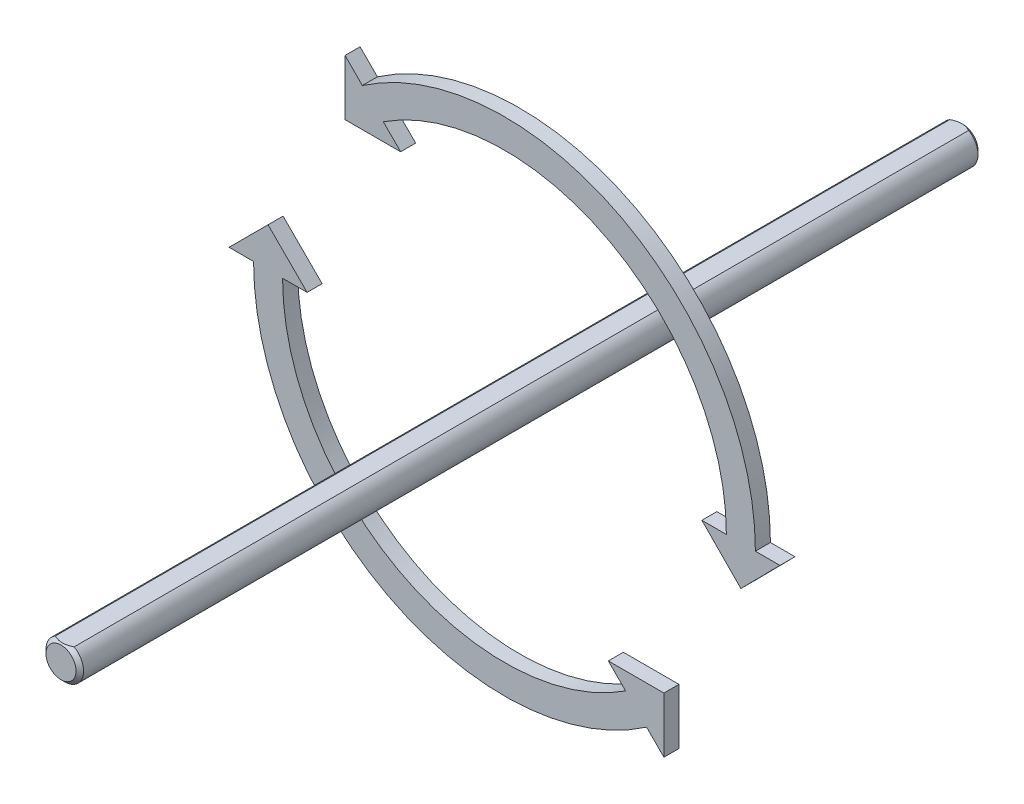
ISO-10303-21;
HEADER;
FILE_DESCRIPTION(('STEP AP214'),'2;1');
FILE_NAME('part.step','',(''),(''),'','','');
FILE_SCHEMA(('AUTOMOTIVE_DESIGN { 1 0 10303 214 1 1 1 1 }'));
ENDSEC;
DATA;
#1=APPLICATION_CONTEXT('core data for automotive mechanical design processes');
#2=APPLICATION_PROTOCOL_DEFINITION('international standard','automotive_design',2000,#1);
#3=PRODUCT_CONTEXT('',#1,'mechanical');
#4=PRODUCT('Part','Part','',(#3));
#5=PRODUCT_RELATED_PRODUCT_CATEGORY('part','',(#4));
#6=PRODUCT_DEFINITION_FORMATION('','',#4);
#7=PRODUCT_DEFINITION_CONTEXT('part definition',#1,'design');
#8=PRODUCT_DEFINITION('design','',#6,#7);
#9=PRODUCT_DEFINITION_SHAPE('','',#8);
#10=(LENGTH_UNIT() NAMED_UNIT(*) SI_UNIT(.MILLI.,.METRE.));
#11=(NAMED_UNIT(*) PLANE_ANGLE_UNIT() SI_UNIT($,.RADIAN.));
#12=(NAMED_UNIT(*) SI_UNIT($,.STERADIAN.) SOLID_ANGLE_UNIT());
#13=UNCERTAINTY_MEASURE_WITH_UNIT(LENGTH_MEASURE(1.E-05),#10,'distance_accuracy_value','');
#14=(GEOMETRIC_REPRESENTATION_CONTEXT(3) GLOBAL_UNCERTAINTY_ASSIGNED_CONTEXT((#13)) GLOBAL_UNIT_ASSIGNED_CONTEXT((#10,
#11,#12)) REPRESENTATION_CONTEXT('',''));
#15=CARTESIAN_POINT('',(0.,0.,0.));
#16=DIRECTION('',(0.,0.,1.));
#17=DIRECTION('',(1.,0.,0.));
#18=AXIS2_PLACEMENT_3D('',#15,#16,#17);
#19=CARTESIAN_POINT('',(-24.0076708422705,34.9446002853386,-1.27));
#20=DIRECTION('',(0.707106781186548,0.707106781186547,0.));
#21=DIRECTION('',(-0.707106781186547,0.707106781186548,0.));
#22=AXIS2_PLACEMENT_3D('',#19,#20,#21);
#23=PLANE('',#22);
#24=DIRECTION('',(0.,0.,1.));
#25=VECTOR('',#24,1.);
#26=CARTESIAN_POINT('',(-26.9402491764315,37.8771786194997,-1.27));
#27=LINE('',#26,#25);
#28=CARTESIAN_POINT('',(-26.9402491764315,37.8771786194997,-1.27));
#29=VERTEX_POINT('',#28);
#30=CARTESIAN_POINT('',(-26.9402491764315,37.8771786194997,1.27));
#31=VERTEX_POINT('',#30);
#32=EDGE_CURVE('E51',#29,#31,#27,.T.);
#33=ORIENTED_EDGE('',*,*,#32,.T.);
#34=DIRECTION('',(-0.707106781186547,0.707106781186548,0.));
#35=VECTOR('',#34,1.);
#36=CARTESIAN_POINT('',(-24.0076708422705,34.9446002853386,1.27));
#37=LINE('',#36,#35);
#38=CARTESIAN_POINT('',(-24.0076708422705,34.9446002853386,1.27));
#39=VERTEX_POINT('',#38);
#40=EDGE_CURVE('E124',#39,#31,#37,.T.);
#41=ORIENTED_EDGE('',*,*,#40,.F.);
#42=DIRECTION('',(0.,0.,1.));
#43=VECTOR('',#42,1.);
#44=CARTESIAN_POINT('',(-24.0076708422705,34.9446002853386,-1.27));
#45=LINE('',#44,#43);
#46=CARTESIAN_POINT('',(-24.0076708422705,34.9446002853386,-1.27));
#47=VERTEX_POINT('',#46);
#48=EDGE_CURVE('E12',#47,#39,#45,.T.);
#49=ORIENTED_EDGE('',*,*,#48,.F.);
#50=DIRECTION('',(-0.707106781186547,0.707106781186548,0.));
#51=VECTOR('',#50,1.);
#52=CARTESIAN_POINT('',(-24.0076708422705,34.9446002853386,-1.27));
#53=LINE('',#52,#51);
#54=EDGE_CURVE('E125',#47,#29,#53,.T.);
#55=ORIENTED_EDGE('',*,*,#54,.T.);
#56=EDGE_LOOP('',(#33,#41,#49,#55));
#57=FACE_BOUND('',#56,.T.);
#58=ADVANCED_FACE('F48',(#57),#23,.T.);
#59=CARTESIAN_POINT('',(0.,0.,-1.27));
#60=DIRECTION('',(0.,0.,1.));
#61=DIRECTION('',(1.,0.,0.));
#62=AXIS2_PLACEMENT_3D('',#59,#60,#61);
#63=CYLINDRICAL_SURFACE('',#62,42.3968554066559);
#64=ORIENTED_EDGE('',*,*,#48,.T.);
#65=CARTESIAN_POINT('',(0.,0.,1.27));
#66=DIRECTION('',(0.,0.,1.));
#67=DIRECTION('',(1.,0.,0.));
#68=AXIS2_PLACEMENT_3D('',#65,#66,#67);
#69=CIRCLE('',#68,42.3968554066559);
#70=CARTESIAN_POINT('',(42.3968554066559,0.,1.27));
#71=VERTEX_POINT('',#70);
#72=EDGE_CURVE('E142',#71,#39,#69,.T.);
#73=ORIENTED_EDGE('',*,*,#72,.F.);
#74=DIRECTION('',(0.,0.,1.));
#75=VECTOR('',#74,1.);
#76=CARTESIAN_POINT('',(42.3968554066559,0.,-1.27));
#77=LINE('',#76,#75);
#78=CARTESIAN_POINT('',(42.3968554066559,0.,-1.27));
#79=VERTEX_POINT('',#78);
#80=EDGE_CURVE('E56',#79,#71,#77,.T.);
#81=ORIENTED_EDGE('',*,*,#80,.F.);
#82=CARTESIAN_POINT('',(0.,0.,-1.27));
#83=DIRECTION('',(0.,0.,1.));
#84=DIRECTION('',(1.,0.,0.));
#85=AXIS2_PLACEMENT_3D('',#82,#83,#84);
#86=CIRCLE('',#85,42.3968554066559);
#87=EDGE_CURVE('E130',#79,#47,#86,.T.);
#88=ORIENTED_EDGE('',*,*,#87,.T.);
#89=EDGE_LOOP('',(#64,#73,#81,#88));
#90=FACE_BOUND('',#89,.T.);
#91=ADVANCED_FACE('F230',(#90),#63,.T.);
#92=CARTESIAN_POINT('',(46.544147459548,0.,-1.27));
#93=DIRECTION('',(0.,1.,0.));
#94=DIRECTION('',(-1.,0.,0.));
#95=AXIS2_PLACEMENT_3D('',#92,#93,#94);
#96=PLANE('',#95);
#97=ORIENTED_EDGE('',*,*,#80,.T.);
#98=DIRECTION('',(-1.,0.,0.));
#99=VECTOR('',#98,1.);
#100=CARTESIAN_POINT('',(46.544147459548,0.,1.27));
#101=LINE('',#100,#99);
#102=CARTESIAN_POINT('',(46.544147459548,0.,1.27));
#103=VERTEX_POINT('',#102);
#104=EDGE_CURVE('E161',#103,#71,#101,.T.);
#105=ORIENTED_EDGE('',*,*,#104,.F.);
#106=DIRECTION('',(0.,0.,1.));
#107=VECTOR('',#106,1.);
#108=CARTESIAN_POINT('',(46.544147459548,0.,-1.27));
#109=LINE('',#108,#107);
#110=CARTESIAN_POINT('',(46.544147459548,0.,-1.27));
#111=VERTEX_POINT('',#110);
#112=EDGE_CURVE('E189',#111,#103,#109,.T.);
#113=ORIENTED_EDGE('',*,*,#112,.F.);
#114=DIRECTION('',(-1.,0.,0.));
#115=VECTOR('',#114,1.);
#116=CARTESIAN_POINT('',(46.544147459548,0.,-1.27));
#117=LINE('',#116,#115);
#118=EDGE_CURVE('E185',#111,#79,#117,.T.);
#119=ORIENTED_EDGE('',*,*,#118,.T.);
#120=EDGE_LOOP('',(#97,#105,#113,#119));
#121=FACE_BOUND('',#120,.T.);
#122=ADVANCED_FACE('F228',(#121),#96,.T.);
#123=CARTESIAN_POINT('',(39.9465328725795,-6.69216374509598,-1.27));
#124=DIRECTION('',(0.712119419020724,-0.702058354450388,0.));
#125=DIRECTION('',(0.702058354450388,0.712119419020724,0.));
#126=AXIS2_PLACEMENT_3D('',#123,#124,#125);
#127=PLANE('',#126);
#128=ORIENTED_EDGE('',*,*,#112,.T.);
#129=DIRECTION('',(0.702058354450388,0.712119419020724,0.));
#130=VECTOR('',#129,1.);
#131=CARTESIAN_POINT('',(39.9465328725795,-6.69216374509598,1.27));
#132=LINE('',#131,#130);
#133=CARTESIAN_POINT('',(39.9465328725795,-6.69216374509598,1.27));
#134=VERTEX_POINT('',#133);
#135=EDGE_CURVE('E158',#134,#103,#132,.T.);
#136=ORIENTED_EDGE('',*,*,#135,.F.);
#137=DIRECTION('',(0.,0.,1.));
#138=VECTOR('',#137,1.);
#139=CARTESIAN_POINT('',(39.9465328725795,-6.69216374509598,-1.27));
#140=LINE('',#139,#138);
#141=CARTESIAN_POINT('',(39.9465328725795,-6.69216374509598,-1.27));
#142=VERTEX_POINT('',#141);
#143=EDGE_CURVE('E191',#142,#134,#140,.T.);
#144=ORIENTED_EDGE('',*,*,#143,.F.);
#145=DIRECTION('',(0.702058354450388,0.712119419020724,0.));
#146=VECTOR('',#145,1.);
#147=CARTESIAN_POINT('',(39.9465328725795,-6.69216374509598,-1.27));
#148=LINE('',#147,#146);
#149=EDGE_CURVE('E182',#142,#111,#148,.T.);
#150=ORIENTED_EDGE('',*,*,#149,.T.);
#151=EDGE_LOOP('',(#128,#136,#144,#150));
#152=FACE_BOUND('',#151,.T.);
#153=ADVANCED_FACE('F224',(#152),#127,.T.);
#154=CARTESIAN_POINT('',(33.3489182856111,0.,-1.27));
#155=DIRECTION('',(-0.712119419020723,-0.702058354450389,0.));
#156=DIRECTION('',(0.702058354450389,-0.712119419020723,0.));
#157=AXIS2_PLACEMENT_3D('',#154,#155,#156);
#158=PLANE('',#157);
#159=ORIENTED_EDGE('',*,*,#143,.T.);
#160=DIRECTION('',(0.702058354450389,-0.712119419020723,0.));
#161=VECTOR('',#160,1.);
#162=CARTESIAN_POINT('',(33.3489182856111,0.,1.27));
#163=LINE('',#162,#161);
#164=CARTESIAN_POINT('',(33.3489182856111,0.,1.27));
#165=VERTEX_POINT('',#164);
#166=EDGE_CURVE('E155',#165,#134,#163,.T.);
#167=ORIENTED_EDGE('',*,*,#166,.F.);
#168=DIRECTION('',(0.,0.,1.));
#169=VECTOR('',#168,1.);
#170=CARTESIAN_POINT('',(33.3489182856111,0.,-1.27));
#171=LINE('',#170,#169);
#172=CARTESIAN_POINT('',(33.3489182856111,0.,-1.27));
#173=VERTEX_POINT('',#172);
#174=EDGE_CURVE('E193',#173,#165,#171,.T.);
#175=ORIENTED_EDGE('',*,*,#174,.F.);
#176=DIRECTION('',(0.702058354450389,-0.712119419020723,0.));
#177=VECTOR('',#176,1.);
#178=CARTESIAN_POINT('',(33.3489182856111,0.,-1.27));
#179=LINE('',#178,#177);
#180=EDGE_CURVE('E179',#173,#142,#179,.T.);
#181=ORIENTED_EDGE('',*,*,#180,.T.);
#182=EDGE_LOOP('',(#159,#167,#175,#181));
#183=FACE_BOUND('',#182,.T.);
#184=ADVANCED_FACE('F222',(#183),#158,.T.);
#185=CARTESIAN_POINT('',(37.4962103385031,0.,-1.27));
#186=DIRECTION('',(0.,1.,0.));
#187=DIRECTION('',(0.,0.,1.));
#188=AXIS2_PLACEMENT_3D('',#185,#186,#187);
#189=PLANE('',#188);
#190=ORIENTED_EDGE('',*,*,#174,.T.);
#191=DIRECTION('',(-1.,0.,0.));
#192=VECTOR('',#191,1.);
#193=CARTESIAN_POINT('',(37.4962103385031,0.,1.27));
#194=LINE('',#193,#192);
#195=CARTESIAN_POINT('',(37.4962103385031,0.,1.27));
#196=VERTEX_POINT('',#195);
#197=EDGE_CURVE('E152',#196,#165,#194,.T.);
#198=ORIENTED_EDGE('',*,*,#197,.F.);
#199=DIRECTION('',(0.,0.,1.));
#200=VECTOR('',#199,1.);
#201=CARTESIAN_POINT('',(37.4962103385031,0.,-1.27));
#202=LINE('',#201,#200);
#203=CARTESIAN_POINT('',(37.4962103385031,0.,-1.27));
#204=VERTEX_POINT('',#203);
#205=EDGE_CURVE('E195',#204,#196,#202,.T.);
#206=ORIENTED_EDGE('',*,*,#205,.F.);
#207=DIRECTION('',(-1.,0.,0.));
#208=VECTOR('',#207,1.);
#209=CARTESIAN_POINT('',(37.4962103385031,0.,-1.27));
#210=LINE('',#209,#208);
#211=EDGE_CURVE('E176',#204,#173,#210,.T.);
#212=ORIENTED_EDGE('',*,*,#211,.T.);
#213=EDGE_LOOP('',(#190,#198,#206,#212));
#214=FACE_BOUND('',#213,.T.);
#215=ADVANCED_FACE('F217',(#214),#189,.T.);
#216=CARTESIAN_POINT('',(0.,0.,-1.27));
#217=DIRECTION('',(0.,0.,1.));
#218=DIRECTION('',(1.,0.,0.));
#219=AXIS2_PLACEMENT_3D('',#216,#217,#218);
#220=CYLINDRICAL_SURFACE('',#219,37.4962103385031);
#221=ORIENTED_EDGE('',*,*,#205,.T.);
#222=CARTESIAN_POINT('',(0.,0.,1.27));
#223=DIRECTION('',(0.,0.,-1.));
#224=DIRECTION('',(1.,0.,0.));
#225=AXIS2_PLACEMENT_3D('',#222,#223,#224);
#226=CIRCLE('',#225,37.4962103385031);
#227=CARTESIAN_POINT('',(-20.4752973122183,31.4122267552864,1.27));
#228=VERTEX_POINT('',#227);
#229=EDGE_CURVE('E149',#228,#196,#226,.T.);
#230=ORIENTED_EDGE('',*,*,#229,.F.);
#231=DIRECTION('',(0.,0.,1.));
#232=VECTOR('',#231,1.);
#233=CARTESIAN_POINT('',(-20.4752973122183,31.4122267552864,-1.27));
#234=LINE('',#233,#232);
#235=CARTESIAN_POINT('',(-20.4752973122183,31.4122267552864,-1.27));
#236=VERTEX_POINT('',#235);
#237=EDGE_CURVE('E197',#236,#228,#234,.T.);
#238=ORIENTED_EDGE('',*,*,#237,.F.);
#239=CARTESIAN_POINT('',(0.,0.,-1.27));
#240=DIRECTION('',(0.,0.,-1.));
#241=DIRECTION('',(1.,0.,0.));
#242=AXIS2_PLACEMENT_3D('',#239,#240,#241);
#243=CIRCLE('',#242,37.4962103385031);
#244=EDGE_CURVE('E173',#236,#204,#243,.T.);
#245=ORIENTED_EDGE('',*,*,#244,.T.);
#246=EDGE_LOOP('',(#221,#230,#238,#245));
#247=FACE_BOUND('',#246,.T.);
#248=ADVANCED_FACE('F210',(#247),#220,.F.);
#249=CARTESIAN_POINT('',(-17.5427189780573,28.4796484211254,-1.27));
#250=DIRECTION('',(0.707106781186547,0.707106781186548,0.));
#251=DIRECTION('',(-0.707106781186548,0.707106781186547,0.));
#252=AXIS2_PLACEMENT_3D('',#249,#250,#251);
#253=PLANE('',#252);
#254=ORIENTED_EDGE('',*,*,#237,.T.);
#255=DIRECTION('',(-0.707106781186548,0.707106781186547,0.));
#256=VECTOR('',#255,1.);
#257=CARTESIAN_POINT('',(-17.5427189780573,28.4796484211254,1.27));
#258=LINE('',#257,#256);
#259=CARTESIAN_POINT('',(-17.5427189780573,28.4796484211254,1.27));
#260=VERTEX_POINT('',#259);
#261=EDGE_CURVE('E146',#260,#228,#258,.T.);
#262=ORIENTED_EDGE('',*,*,#261,.F.);
#263=DIRECTION('',(0.,0.,1.));
#264=VECTOR('',#263,1.);
#265=CARTESIAN_POINT('',(-17.5427189780573,28.4796484211254,-1.27));
#266=LINE('',#265,#264);
#267=CARTESIAN_POINT('',(-17.5427189780573,28.4796484211254,-1.27));
#268=VERTEX_POINT('',#267);
#269=EDGE_CURVE('E199',#268,#260,#266,.T.);
#270=ORIENTED_EDGE('',*,*,#269,.F.);
#271=DIRECTION('',(-0.707106781186548,0.707106781186547,0.));
#272=VECTOR('',#271,1.);
#273=CARTESIAN_POINT('',(-17.5427189780573,28.4796484211254,-1.27));
#274=LINE('',#273,#272);
#275=EDGE_CURVE('E170',#268,#236,#274,.T.);
#276=ORIENTED_EDGE('',*,*,#275,.T.);
#277=EDGE_LOOP('',(#254,#262,#270,#276));
#278=FACE_BOUND('',#277,.T.);
#279=ADVANCED_FACE('F207',(#278),#253,.T.);
#280=CARTESIAN_POINT('',(-26.9402491764315,28.4796484211254,-1.27));
#281=DIRECTION('',(0.,-1.,0.));
#282=DIRECTION('',(1.,0.,0.));
#283=AXIS2_PLACEMENT_3D('',#280,#281,#282);
#284=PLANE('',#283);
#285=ORIENTED_EDGE('',*,*,#269,.T.);
#286=DIRECTION('',(1.,0.,0.));
#287=VECTOR('',#286,1.);
#288=CARTESIAN_POINT('',(-26.9402491764315,28.4796484211254,1.27));
#289=LINE('',#288,#287);
#290=CARTESIAN_POINT('',(-26.9402491764315,28.4796484211254,1.27));
#291=VERTEX_POINT('',#290);
#292=EDGE_CURVE('E137',#291,#260,#289,.T.);
#293=ORIENTED_EDGE('',*,*,#292,.F.);
#294=DIRECTION('',(0.,0.,1.));
#295=VECTOR('',#294,1.);
#296=CARTESIAN_POINT('',(-26.9402491764315,28.4796484211254,-1.27));
#297=LINE('',#296,#295);
#298=CARTESIAN_POINT('',(-26.9402491764315,28.4796484211254,-1.27));
#299=VERTEX_POINT('',#298);
#300=EDGE_CURVE('E129',#299,#291,#297,.T.);
#301=ORIENTED_EDGE('',*,*,#300,.F.);
#302=DIRECTION('',(1.,0.,0.));
#303=VECTOR('',#302,1.);
#304=CARTESIAN_POINT('',(-26.9402491764315,28.4796484211254,-1.27));
#305=LINE('',#304,#303);
#306=EDGE_CURVE('E167',#299,#268,#305,.T.);
#307=ORIENTED_EDGE('',*,*,#306,.T.);
#308=EDGE_LOOP('',(#285,#293,#301,#307));
#309=FACE_BOUND('',#308,.T.);
#310=ADVANCED_FACE('F201',(#309),#284,.T.);
#311=CARTESIAN_POINT('',(-26.9402491764315,37.8771786194997,-1.27));
#312=DIRECTION('',(-1.,0.,0.));
#313=DIRECTION('',(0.,0.,1.));
#314=AXIS2_PLACEMENT_3D('',#311,#312,#313);
#315=PLANE('',#314);
#316=ORIENTED_EDGE('',*,*,#300,.T.);
#317=DIRECTION('',(0.,-1.,0.));
#318=VECTOR('',#317,1.);
#319=CARTESIAN_POINT('',(-26.9402491764315,37.8771786194997,1.27));
#320=LINE('',#319,#318);
#321=EDGE_CURVE('E132',#31,#291,#320,.T.);
#322=ORIENTED_EDGE('',*,*,#321,.F.);
#323=ORIENTED_EDGE('',*,*,#32,.F.);
#324=DIRECTION('',(0.,-1.,0.));
#325=VECTOR('',#324,1.);
#326=CARTESIAN_POINT('',(-26.9402491764315,37.8771786194997,-1.27));
#327=LINE('',#326,#325);
#328=EDGE_CURVE('E165',#29,#299,#327,.T.);
#329=ORIENTED_EDGE('',*,*,#328,.T.);
#330=EDGE_LOOP('',(#316,#322,#323,#329));
#331=FACE_BOUND('',#330,.T.);
#332=ADVANCED_FACE('F133',(#331),#315,.T.);
#333=CARTESIAN_POINT('',(0.,0.,-1.27));
#334=DIRECTION('',(0.,0.,1.));
#335=DIRECTION('',(1.,0.,0.));
#336=AXIS2_PLACEMENT_3D('',#333,#334,#335);
#337=PLANE('',#336);
#338=ORIENTED_EDGE('',*,*,#54,.F.);
#339=ORIENTED_EDGE('',*,*,#87,.F.);
#340=ORIENTED_EDGE('',*,*,#118,.F.);
#341=ORIENTED_EDGE('',*,*,#149,.F.);
#342=ORIENTED_EDGE('',*,*,#180,.F.);
#343=ORIENTED_EDGE('',*,*,#211,.F.);
#344=ORIENTED_EDGE('',*,*,#244,.F.);
#345=ORIENTED_EDGE('',*,*,#275,.F.);
#346=ORIENTED_EDGE('',*,*,#306,.F.);
#347=ORIENTED_EDGE('',*,*,#328,.F.);
#348=EDGE_LOOP('',(#338,#339,#340,#341,#342,#343,#344,#345,#346,#347));
#349=FACE_BOUND('',#348,.T.);
#350=ADVANCED_FACE('F213',(#349),#337,.F.);
#351=CARTESIAN_POINT('',(0.,0.,1.27));
#352=DIRECTION('',(0.,0.,1.));
#353=DIRECTION('',(1.,0.,0.));
#354=AXIS2_PLACEMENT_3D('',#351,#352,#353);
#355=PLANE('',#354);
#356=ORIENTED_EDGE('',*,*,#40,.T.);
#357=ORIENTED_EDGE('',*,*,#321,.T.);
#358=ORIENTED_EDGE('',*,*,#292,.T.);
#359=ORIENTED_EDGE('',*,*,#261,.T.);
#360=ORIENTED_EDGE('',*,*,#229,.T.);
#361=ORIENTED_EDGE('',*,*,#197,.T.);
#362=ORIENTED_EDGE('',*,*,#166,.T.);
#363=ORIENTED_EDGE('',*,*,#135,.T.);
#364=ORIENTED_EDGE('',*,*,#104,.T.);
#365=ORIENTED_EDGE('',*,*,#72,.T.);
#366=EDGE_LOOP('',(#356,#357,#358,#359,#360,#361,#362,#363,#364,#365));
#367=FACE_BOUND('',#366,.T.);
#368=ADVANCED_FACE('F140',(#367),#355,.T.);
#369=CLOSED_SHELL('',(#58,#91,#122,#153,#184,#215,#248,#279,#310,#332,#350,#368));
#370=MANIFOLD_SOLID_BREP('B2',#369);
#371=CARTESIAN_POINT('',(-39.9465328725795,6.59761458696847,-1.27));
#372=DIRECTION('',(-0.707106781186548,0.707106781186548,0.));
#373=DIRECTION('',(-0.707106781186548,-0.707106781186548,0.));
#374=AXIS2_PLACEMENT_3D('',#371,#372,#373);
#375=PLANE('',#374);
#376=DIRECTION('',(0.,0.,1.));
#377=VECTOR('',#376,1.);
#378=CARTESIAN_POINT('',(-46.544147459548,0.,-1.27));
#379=LINE('',#378,#377);
#380=CARTESIAN_POINT('',(-46.544147459548,0.,-1.27));
#381=VERTEX_POINT('',#380);
#382=CARTESIAN_POINT('',(-46.544147459548,0.,1.27));
#383=VERTEX_POINT('',#382);
#384=EDGE_CURVE('E340',#381,#383,#379,.T.);
#385=ORIENTED_EDGE('',*,*,#384,.T.);
#386=DIRECTION('',(-0.707106781186547,-0.707106781186547,0.));
#387=VECTOR('',#386,1.);
#388=CARTESIAN_POINT('',(-39.9465328725795,6.59761458696847,1.27));
#389=LINE('',#388,#387);
#390=CARTESIAN_POINT('',(-39.9465328725795,6.59761458696847,1.27));
#391=VERTEX_POINT('',#390);
#392=EDGE_CURVE('E413',#391,#383,#389,.T.);
#393=ORIENTED_EDGE('',*,*,#392,.F.);
#394=DIRECTION('',(0.,0.,1.));
#395=VECTOR('',#394,1.);
#396=CARTESIAN_POINT('',(-39.9465328725795,6.59761458696847,-1.27));
#397=LINE('',#396,#395);
#398=CARTESIAN_POINT('',(-39.9465328725795,6.59761458696847,-1.27));
#399=VERTEX_POINT('',#398);
#400=EDGE_CURVE('E46',#399,#391,#397,.T.);
#401=ORIENTED_EDGE('',*,*,#400,.F.);
#402=DIRECTION('',(-0.707106781186547,-0.707106781186547,0.));
#403=VECTOR('',#402,1.);
#404=CARTESIAN_POINT('',(-39.9465328725795,6.59761458696847,-1.27));
#405=LINE('',#404,#403);
#406=EDGE_CURVE('E414',#399,#381,#405,.T.);
#407=ORIENTED_EDGE('',*,*,#406,.T.);
#408=EDGE_LOOP('',(#385,#393,#401,#407));
#409=FACE_BOUND('',#408,.T.);
#410=ADVANCED_FACE('F337',(#409),#375,.T.);
#411=CARTESIAN_POINT('',(-33.3489182856111,0.,-1.27));
#412=DIRECTION('',(0.707106781186548,0.707106781186548,0.));
#413=DIRECTION('',(-0.707106781186548,0.707106781186548,0.));
#414=AXIS2_PLACEMENT_3D('',#411,#412,#413);
#415=PLANE('',#414);
#416=ORIENTED_EDGE('',*,*,#400,.T.);
#417=DIRECTION('',(-0.707106781186547,0.707106781186547,0.));
#418=VECTOR('',#417,1.);
#419=CARTESIAN_POINT('',(-33.3489182856111,0.,1.27));
#420=LINE('',#419,#418);
#421=CARTESIAN_POINT('',(-33.3489182856111,0.,1.27));
#422=VERTEX_POINT('',#421);
#423=EDGE_CURVE('E431',#422,#391,#420,.T.);
#424=ORIENTED_EDGE('',*,*,#423,.F.);
#425=DIRECTION('',(0.,0.,1.));
#426=VECTOR('',#425,1.);
#427=CARTESIAN_POINT('',(-33.3489182856111,0.,-1.27));
#428=LINE('',#427,#426);
#429=CARTESIAN_POINT('',(-33.3489182856111,0.,-1.27));
#430=VERTEX_POINT('',#429);
#431=EDGE_CURVE('E345',#430,#422,#428,.T.);
#432=ORIENTED_EDGE('',*,*,#431,.F.);
#433=DIRECTION('',(-0.707106781186547,0.707106781186547,0.));
#434=VECTOR('',#433,1.);
#435=CARTESIAN_POINT('',(-33.3489182856111,0.,-1.27));
#436=LINE('',#435,#434);
#437=EDGE_CURVE('E419',#430,#399,#436,.T.);
#438=ORIENTED_EDGE('',*,*,#437,.T.);
#439=EDGE_LOOP('',(#416,#424,#432,#438));
#440=FACE_BOUND('',#439,.T.);
#441=ADVANCED_FACE('F519',(#440),#415,.T.);
#442=CARTESIAN_POINT('',(-37.4962103385031,0.,-1.27));
#443=DIRECTION('',(0.,-1.,0.));
#444=DIRECTION('',(0.,0.,-1.));
#445=AXIS2_PLACEMENT_3D('',#442,#443,#444);
#446=PLANE('',#445);
#447=ORIENTED_EDGE('',*,*,#431,.T.);
#448=DIRECTION('',(1.,0.,0.));
#449=VECTOR('',#448,1.);
#450=CARTESIAN_POINT('',(-37.4962103385031,0.,1.27));
#451=LINE('',#450,#449);
#452=CARTESIAN_POINT('',(-37.4962103385031,0.,1.27));
#453=VERTEX_POINT('',#452);
#454=EDGE_CURVE('E450',#453,#422,#451,.T.);
#455=ORIENTED_EDGE('',*,*,#454,.F.);
#456=DIRECTION('',(0.,0.,1.));
#457=VECTOR('',#456,1.);
#458=CARTESIAN_POINT('',(-37.4962103385031,0.,-1.27));
#459=LINE('',#458,#457);
#460=CARTESIAN_POINT('',(-37.4962103385031,0.,-1.27));
#461=VERTEX_POINT('',#460);
#462=EDGE_CURVE('E478',#461,#453,#459,.T.);
#463=ORIENTED_EDGE('',*,*,#462,.F.);
#464=DIRECTION('',(1.,0.,0.));
#465=VECTOR('',#464,1.);
#466=CARTESIAN_POINT('',(-37.4962103385031,0.,-1.27));
#467=LINE('',#466,#465);
#468=EDGE_CURVE('E474',#461,#430,#467,.T.);
#469=ORIENTED_EDGE('',*,*,#468,.T.);
#470=EDGE_LOOP('',(#447,#455,#463,#469));
#471=FACE_BOUND('',#470,.T.);
#472=ADVANCED_FACE('F517',(#471),#446,.T.);
#473=CARTESIAN_POINT('',(0.,0.,-1.27));
#474=DIRECTION('',(0.,0.,1.));
#475=DIRECTION('',(1.,0.,0.));
#476=AXIS2_PLACEMENT_3D('',#473,#474,#475);
#477=CYLINDRICAL_SURFACE('',#476,37.4962103385031);
#478=ORIENTED_EDGE('',*,*,#462,.T.);
#479=CARTESIAN_POINT('',(0.,0.,1.27));
#480=DIRECTION('',(0.,0.,-1.));
#481=DIRECTION('',(1.,0.,0.));
#482=AXIS2_PLACEMENT_3D('',#479,#480,#481);
#483=CIRCLE('',#482,37.4962103385031);
#484=CARTESIAN_POINT('',(20.4752973122183,-31.4122267552864,1.27));
#485=VERTEX_POINT('',#484);
#486=EDGE_CURVE('E447',#485,#453,#483,.T.);
#487=ORIENTED_EDGE('',*,*,#486,.F.);
#488=DIRECTION('',(0.,0.,1.));
#489=VECTOR('',#488,1.);
#490=CARTESIAN_POINT('',(20.4752973122183,-31.4122267552864,-1.27));
#491=LINE('',#490,#489);
#492=CARTESIAN_POINT('',(20.4752973122183,-31.4122267552864,-1.27));
#493=VERTEX_POINT('',#492);
#494=EDGE_CURVE('E480',#493,#485,#491,.T.);
#495=ORIENTED_EDGE('',*,*,#494,.F.);
#496=CARTESIAN_POINT('',(0.,0.,-1.27));
#497=DIRECTION('',(0.,0.,-1.));
#498=DIRECTION('',(1.,0.,0.));
#499=AXIS2_PLACEMENT_3D('',#496,#497,#498);
#500=CIRCLE('',#499,37.4962103385031);
#501=EDGE_CURVE('E471',#493,#461,#500,.T.);
#502=ORIENTED_EDGE('',*,*,#501,.T.);
#503=EDGE_LOOP('',(#478,#487,#495,#502));
#504=FACE_BOUND('',#503,.T.);
#505=ADVANCED_FACE('F513',(#504),#477,.F.);
#506=CARTESIAN_POINT('',(17.5427189780573,-28.4796484211254,-1.27));
#507=DIRECTION('',(-0.707106781186548,-0.707106781186548,0.));
#508=DIRECTION('',(0.707106781186548,-0.707106781186548,0.));
#509=AXIS2_PLACEMENT_3D('',#506,#507,#508);
#510=PLANE('',#509);
#511=ORIENTED_EDGE('',*,*,#494,.T.);
#512=DIRECTION('',(0.707106781186548,-0.707106781186548,0.));
#513=VECTOR('',#512,1.);
#514=CARTESIAN_POINT('',(17.5427189780573,-28.4796484211254,1.27));
#515=LINE('',#514,#513);
#516=CARTESIAN_POINT('',(17.5427189780573,-28.4796484211254,1.27));
#517=VERTEX_POINT('',#516);
#518=EDGE_CURVE('E444',#517,#485,#515,.T.);
#519=ORIENTED_EDGE('',*,*,#518,.F.);
#520=DIRECTION('',(0.,0.,1.));
#521=VECTOR('',#520,1.);
#522=CARTESIAN_POINT('',(17.5427189780573,-28.4796484211254,-1.27));
#523=LINE('',#522,#521);
#524=CARTESIAN_POINT('',(17.5427189780573,-28.4796484211254,-1.27));
#525=VERTEX_POINT('',#524);
#526=EDGE_CURVE('E482',#525,#517,#523,.T.);
#527=ORIENTED_EDGE('',*,*,#526,.F.);
#528=DIRECTION('',(0.707106781186548,-0.707106781186548,0.));
#529=VECTOR('',#528,1.);
#530=CARTESIAN_POINT('',(17.5427189780573,-28.4796484211254,-1.27));
#531=LINE('',#530,#529);
#532=EDGE_CURVE('E468',#525,#493,#531,.T.);
#533=ORIENTED_EDGE('',*,*,#532,.T.);
#534=EDGE_LOOP('',(#511,#519,#527,#533));
#535=FACE_BOUND('',#534,.T.);
#536=ADVANCED_FACE('F511',(#535),#510,.T.);
#537=CARTESIAN_POINT('',(26.9402491764315,-28.4796484211254,-1.27));
#538=DIRECTION('',(0.,1.,0.));
#539=DIRECTION('',(-1.,0.,0.));
#540=AXIS2_PLACEMENT_3D('',#537,#538,#539);
#541=PLANE('',#540);
#542=ORIENTED_EDGE('',*,*,#526,.T.);
#543=DIRECTION('',(-1.,0.,0.));
#544=VECTOR('',#543,1.);
#545=CARTESIAN_POINT('',(26.9402491764315,-28.4796484211254,1.27));
#546=LINE('',#545,#544);
#547=CARTESIAN_POINT('',(26.9402491764315,-28.4796484211254,1.27));
#548=VERTEX_POINT('',#547);
#549=EDGE_CURVE('E441',#548,#517,#546,.T.);
#550=ORIENTED_EDGE('',*,*,#549,.F.);
#551=DIRECTION('',(0.,0.,1.));
#552=VECTOR('',#551,1.);
#553=CARTESIAN_POINT('',(26.9402491764315,-28.4796484211254,-1.27));
#554=LINE('',#553,#552);
#555=CARTESIAN_POINT('',(26.9402491764315,-28.4796484211254,-1.27));
#556=VERTEX_POINT('',#555);
#557=EDGE_CURVE('E484',#556,#548,#554,.T.);
#558=ORIENTED_EDGE('',*,*,#557,.F.);
#559=DIRECTION('',(-1.,0.,0.));
#560=VECTOR('',#559,1.);
#561=CARTESIAN_POINT('',(26.9402491764315,-28.4796484211254,-1.27));
#562=LINE('',#561,#560);
#563=EDGE_CURVE('E465',#556,#525,#562,.T.);
#564=ORIENTED_EDGE('',*,*,#563,.T.);
#565=EDGE_LOOP('',(#542,#550,#558,#564));
#566=FACE_BOUND('',#565,.T.);
#567=ADVANCED_FACE('F506',(#566),#541,.T.);
#568=CARTESIAN_POINT('',(26.9402491764315,-37.8771786194996,-1.27));
#569=DIRECTION('',(1.,0.,0.));
#570=DIRECTION('',(0.,0.,-1.));
#571=AXIS2_PLACEMENT_3D('',#568,#569,#570);
#572=PLANE('',#571);
#573=ORIENTED_EDGE('',*,*,#557,.T.);
#574=DIRECTION('',(0.,1.,0.));
#575=VECTOR('',#574,1.);
#576=CARTESIAN_POINT('',(26.9402491764315,-37.8771786194996,1.27));
#577=LINE('',#576,#575);
#578=CARTESIAN_POINT('',(26.9402491764315,-37.8771786194996,1.27));
#579=VERTEX_POINT('',#578);
#580=EDGE_CURVE('E438',#579,#548,#577,.T.);
#581=ORIENTED_EDGE('',*,*,#580,.F.);
#582=DIRECTION('',(0.,0.,1.));
#583=VECTOR('',#582,1.);
#584=CARTESIAN_POINT('',(26.9402491764315,-37.8771786194996,-1.27));
#585=LINE('',#584,#583);
#586=CARTESIAN_POINT('',(26.9402491764315,-37.8771786194996,-1.27));
#587=VERTEX_POINT('',#586);
#588=EDGE_CURVE('E486',#587,#579,#585,.T.);
#589=ORIENTED_EDGE('',*,*,#588,.F.);
#590=DIRECTION('',(0.,1.,0.));
#591=VECTOR('',#590,1.);
#592=CARTESIAN_POINT('',(26.9402491764315,-37.8771786194996,-1.27));
#593=LINE('',#592,#591);
#594=EDGE_CURVE('E462',#587,#556,#593,.T.);
#595=ORIENTED_EDGE('',*,*,#594,.T.);
#596=EDGE_LOOP('',(#573,#581,#589,#595));
#597=FACE_BOUND('',#596,.T.);
#598=ADVANCED_FACE('F499',(#597),#572,.T.);
#599=CARTESIAN_POINT('',(24.0076708422705,-34.9446002853386,-1.27));
#600=DIRECTION('',(-0.707106781186548,-0.707106781186548,0.));
#601=DIRECTION('',(0.707106781186548,-0.707106781186548,0.));
#602=AXIS2_PLACEMENT_3D('',#599,#600,#601);
#603=PLANE('',#602);
#604=ORIENTED_EDGE('',*,*,#588,.T.);
#605=DIRECTION('',(0.707106781186547,-0.707106781186547,0.));
#606=VECTOR('',#605,1.);
#607=CARTESIAN_POINT('',(24.0076708422705,-34.9446002853386,1.27));
#608=LINE('',#607,#606);
#609=CARTESIAN_POINT('',(24.0076708422705,-34.9446002853386,1.27));
#610=VERTEX_POINT('',#609);
#611=EDGE_CURVE('E435',#610,#579,#608,.T.);
#612=ORIENTED_EDGE('',*,*,#611,.F.);
#613=DIRECTION('',(0.,0.,1.));
#614=VECTOR('',#613,1.);
#615=CARTESIAN_POINT('',(24.0076708422705,-34.9446002853386,-1.27));
#616=LINE('',#615,#614);
#617=CARTESIAN_POINT('',(24.0076708422705,-34.9446002853386,-1.27));
#618=VERTEX_POINT('',#617);
#619=EDGE_CURVE('E488',#618,#610,#616,.T.);
#620=ORIENTED_EDGE('',*,*,#619,.F.);
#621=DIRECTION('',(0.707106781186547,-0.707106781186547,0.));
#622=VECTOR('',#621,1.);
#623=CARTESIAN_POINT('',(24.0076708422705,-34.9446002853386,-1.27));
#624=LINE('',#623,#622);
#625=EDGE_CURVE('E459',#618,#587,#624,.T.);
#626=ORIENTED_EDGE('',*,*,#625,.T.);
#627=EDGE_LOOP('',(#604,#612,#620,#626));
#628=FACE_BOUND('',#627,.T.);
#629=ADVANCED_FACE('F496',(#628),#603,.T.);
#630=CARTESIAN_POINT('',(0.,0.,-1.27));
#631=DIRECTION('',(0.,0.,1.));
#632=DIRECTION('',(1.,0.,0.));
#633=AXIS2_PLACEMENT_3D('',#630,#631,#632);
#634=CYLINDRICAL_SURFACE('',#633,42.3968554066559);
#635=ORIENTED_EDGE('',*,*,#619,.T.);
#636=CARTESIAN_POINT('',(0.,0.,1.27));
#637=DIRECTION('',(0.,0.,1.));
#638=DIRECTION('',(1.,0.,0.));
#639=AXIS2_PLACEMENT_3D('',#636,#637,#638);
#640=CIRCLE('',#639,42.3968554066559);
#641=CARTESIAN_POINT('',(-42.3968554066559,0.,1.27));
#642=VERTEX_POINT('',#641);
#643=EDGE_CURVE('E426',#642,#610,#640,.T.);
#644=ORIENTED_EDGE('',*,*,#643,.F.);
#645=DIRECTION('',(0.,0.,1.));
#646=VECTOR('',#645,1.);
#647=CARTESIAN_POINT('',(-42.3968554066559,0.,-1.27));
#648=LINE('',#647,#646);
#649=CARTESIAN_POINT('',(-42.3968554066559,0.,-1.27));
#650=VERTEX_POINT('',#649);
#651=EDGE_CURVE('E418',#650,#642,#648,.T.);
#652=ORIENTED_EDGE('',*,*,#651,.F.);
#653=CARTESIAN_POINT('',(0.,0.,-1.27));
#654=DIRECTION('',(0.,0.,1.));
#655=DIRECTION('',(1.,0.,0.));
#656=AXIS2_PLACEMENT_3D('',#653,#654,#655);
#657=CIRCLE('',#656,42.3968554066559);
#658=EDGE_CURVE('E456',#650,#618,#657,.T.);
#659=ORIENTED_EDGE('',*,*,#658,.T.);
#660=EDGE_LOOP('',(#635,#644,#652,#659));
#661=FACE_BOUND('',#660,.T.);
#662=ADVANCED_FACE('F490',(#661),#634,.T.);
#663=CARTESIAN_POINT('',(-46.544147459548,0.,-1.27));
#664=DIRECTION('',(0.,-1.,0.));
#665=DIRECTION('',(0.,0.,-1.));
#666=AXIS2_PLACEMENT_3D('',#663,#664,#665);
#667=PLANE('',#666);
#668=ORIENTED_EDGE('',*,*,#651,.T.);
#669=DIRECTION('',(1.,0.,0.));
#670=VECTOR('',#669,1.);
#671=CARTESIAN_POINT('',(-46.544147459548,0.,1.27));
#672=LINE('',#671,#670);
#673=EDGE_CURVE('E421',#383,#642,#672,.T.);
#674=ORIENTED_EDGE('',*,*,#673,.F.);
#675=ORIENTED_EDGE('',*,*,#384,.F.);
#676=DIRECTION('',(1.,0.,0.));
#677=VECTOR('',#676,1.);
#678=CARTESIAN_POINT('',(-46.544147459548,0.,-1.27));
#679=LINE('',#678,#677);
#680=EDGE_CURVE('E454',#381,#650,#679,.T.);
#681=ORIENTED_EDGE('',*,*,#680,.T.);
#682=EDGE_LOOP('',(#668,#674,#675,#681));
#683=FACE_BOUND('',#682,.T.);
#684=ADVANCED_FACE('F422',(#683),#667,.T.);
#685=CARTESIAN_POINT('',(0.,0.,-1.27));
#686=DIRECTION('',(0.,0.,1.));
#687=DIRECTION('',(1.,0.,0.));
#688=AXIS2_PLACEMENT_3D('',#685,#686,#687);
#689=PLANE('',#688);
#690=ORIENTED_EDGE('',*,*,#406,.F.);
#691=ORIENTED_EDGE('',*,*,#437,.F.);
#692=ORIENTED_EDGE('',*,*,#468,.F.);
#693=ORIENTED_EDGE('',*,*,#501,.F.);
#694=ORIENTED_EDGE('',*,*,#532,.F.);
#695=ORIENTED_EDGE('',*,*,#563,.F.);
#696=ORIENTED_EDGE('',*,*,#594,.F.);
#697=ORIENTED_EDGE('',*,*,#625,.F.);
#698=ORIENTED_EDGE('',*,*,#658,.F.);
#699=ORIENTED_EDGE('',*,*,#680,.F.);
#700=EDGE_LOOP('',(#690,#691,#692,#693,#694,#695,#696,#697,#698,#699));
#701=FACE_BOUND('',#700,.T.);
#702=ADVANCED_FACE('F502',(#701),#689,.F.);
#703=CARTESIAN_POINT('',(0.,0.,1.27));
#704=DIRECTION('',(0.,0.,1.));
#705=DIRECTION('',(1.,0.,0.));
#706=AXIS2_PLACEMENT_3D('',#703,#704,#705);
#707=PLANE('',#706);
#708=ORIENTED_EDGE('',*,*,#392,.T.);
#709=ORIENTED_EDGE('',*,*,#673,.T.);
#710=ORIENTED_EDGE('',*,*,#643,.T.);
#711=ORIENTED_EDGE('',*,*,#611,.T.);
#712=ORIENTED_EDGE('',*,*,#580,.T.);
#713=ORIENTED_EDGE('',*,*,#549,.T.);
#714=ORIENTED_EDGE('',*,*,#518,.T.);
#715=ORIENTED_EDGE('',*,*,#486,.T.);
#716=ORIENTED_EDGE('',*,*,#454,.T.);
#717=ORIENTED_EDGE('',*,*,#423,.T.);
#718=EDGE_LOOP('',(#708,#709,#710,#711,#712,#713,#714,#715,#716,#717));
#719=FACE_BOUND('',#718,.T.);
#720=ADVANCED_FACE('F429',(#719),#707,.T.);
#721=CLOSED_SHELL('',(#410,#441,#472,#505,#536,#567,#598,#629,#662,#684,#702,#720));
#722=MANIFOLD_SOLID_BREP('B6',#721);
#723=CARTESIAN_POINT('',(0.,0.,76.2));
#724=DIRECTION('',(0.,0.,-1.));
#725=DIRECTION('',(-1.,0.,0.));
#726=AXIS2_PLACEMENT_3D('',#723,#724,#725);
#727=CYLINDRICAL_SURFACE('',#726,3.175);
#728=CARTESIAN_POINT('',(0.,0.,75.5650000000001));
#729=DIRECTION('',(0.,0.,1.));
#730=DIRECTION('',(1.,0.,0.));
#731=AXIS2_PLACEMENT_3D('',#728,#729,#730);
#732=CIRCLE('',#731,3.175);
#733=CARTESIAN_POINT('',(1.5875,2.74963065701559,75.5650000000001));
#734=VERTEX_POINT('',#733);
#735=CARTESIAN_POINT('',(-1.5875,2.74963065701559,75.5650000000001));
#736=VERTEX_POINT('',#735);
#737=EDGE_CURVE('E670',#734,#736,#732,.F.);
#738=ORIENTED_EDGE('',*,*,#737,.T.);
#739=DIRECTION('',(0.,0.,1.));
#740=VECTOR('',#739,1.);
#741=CARTESIAN_POINT('',(-1.5875,2.74963065701559,-76.2));
#742=LINE('',#741,#740);
#743=CARTESIAN_POINT('',(-1.5875,2.74963065701559,-75.5649999999999));
#744=VERTEX_POINT('',#743);
#745=EDGE_CURVE('E648',#744,#736,#742,.T.);
#746=ORIENTED_EDGE('',*,*,#745,.F.);
#747=CARTESIAN_POINT('',(0.,0.,-75.5649999999999));
#748=DIRECTION('',(0.,0.,1.));
#749=DIRECTION('',(1.,0.,0.));
#750=AXIS2_PLACEMENT_3D('',#747,#748,#749);
#751=CIRCLE('',#750,3.175);
#752=CARTESIAN_POINT('',(1.5875,2.74963065701559,-75.5649999999999));
#753=VERTEX_POINT('',#752);
#754=EDGE_CURVE('E669',#744,#753,#751,.T.);
#755=ORIENTED_EDGE('',*,*,#754,.T.);
#756=DIRECTION('',(0.,0.,1.));
#757=VECTOR('',#756,1.);
#758=CARTESIAN_POINT('',(1.5875,2.74963065701559,-76.2));
#759=LINE('',#758,#757);
#760=EDGE_CURVE('E658',#753,#734,#759,.T.);
#761=ORIENTED_EDGE('',*,*,#760,.T.);
#762=EDGE_LOOP('',(#738,#746,#755,#761));
#763=FACE_BOUND('',#762,.T.);
#764=ADVANCED_FACE('F628',(#763),#727,.T.);
#765=CARTESIAN_POINT('',(0.,0.,76.2));
#766=DIRECTION('',(0.,0.,1.));
#767=DIRECTION('',(1.,0.,0.));
#768=AXIS2_PLACEMENT_3D('',#765,#766,#767);
#769=PLANE('',#768);
#770=CARTESIAN_POINT('',(0.,0.,76.2));
#771=DIRECTION('',(0.,0.,1.));
#772=DIRECTION('',(1.,0.,0.));
#773=AXIS2_PLACEMENT_3D('',#770,#771,#772);
#774=CIRCLE('',#773,2.54000000000008);
#775=CARTESIAN_POINT('',(2.54000000000008,0.,76.2));
#776=VERTEX_POINT('',#775);
#777=EDGE_CURVE('E642',#776,#776,#774,.T.);
#778=ORIENTED_EDGE('',*,*,#777,.T.);
#779=EDGE_LOOP('',(#778));
#780=FACE_BOUND('',#779,.T.);
#781=ADVANCED_FACE('F680',(#780),#769,.T.);
#782=CARTESIAN_POINT('',(0.,0.,-76.2));
#783=DIRECTION('',(0.,0.,1.));
#784=DIRECTION('',(1.,0.,0.));
#785=AXIS2_PLACEMENT_3D('',#782,#783,#784);
#786=PLANE('',#785);
#787=CARTESIAN_POINT('',(0.,0.,-76.2));
#788=DIRECTION('',(0.,0.,1.));
#789=DIRECTION('',(1.,0.,0.));
#790=AXIS2_PLACEMENT_3D('',#787,#788,#789);
#791=CIRCLE('',#790,2.53999999999988);
#792=CARTESIAN_POINT('',(2.53999999999988,0.,-76.2));
#793=VERTEX_POINT('',#792);
#794=EDGE_CURVE('E672',#793,#793,#791,.F.);
#795=ORIENTED_EDGE('',*,*,#794,.T.);
#796=EDGE_LOOP('',(#795));
#797=FACE_BOUND('',#796,.T.);
#798=ADVANCED_FACE('F688',(#797),#786,.F.);
#799=CARTESIAN_POINT('',(0.,0.,-75.5649999999999));
#800=DIRECTION('',(0.,0.,1.));
#801=DIRECTION('',(1.,0.,0.));
#802=AXIS2_PLACEMENT_3D('',#799,#800,#801);
#803=CONICAL_SURFACE('',#802,3.175,0.785398163397441);
#804=CARTESIAN_POINT('',(-3.22896135223723,2.74963065701559,-74.4989317189837));
#805=CARTESIAN_POINT('',(-3.15061649550098,2.74963065701559,-74.5585665245459));
#806=CARTESIAN_POINT('',(-3.07184009651257,2.74963065701559,-74.6176434820249));
#807=CARTESIAN_POINT('',(-2.91325130568812,2.74963065701559,-74.7344297176182));
#808=CARTESIAN_POINT('',(-2.83343866506288,2.74963065701559,-74.7921386575257));
#809=CARTESIAN_POINT('',(-2.6720206285274,2.74963065701559,-74.906347547805));
#810=CARTESIAN_POINT('',(-2.59040613970423,2.74963065701559,-74.9628346895371));
#811=CARTESIAN_POINT('',(-2.42580311622158,2.74963065701559,-75.0737635143343));
#812=CARTESIAN_POINT('',(-2.3428146780933,2.74963065701559,-75.1282053402284));
#813=CARTESIAN_POINT('',(-2.17021447787224,2.74963065701559,-75.2377738711655));
#814=CARTESIAN_POINT('',(-2.08050398524188,2.74963065701559,-75.2927458353401));
#815=CARTESIAN_POINT('',(-1.89900904678686,2.74963065701559,-75.3991469931977));
#816=CARTESIAN_POINT('',(-1.80722487525631,2.74963065701559,-75.4505766518348));
#817=CARTESIAN_POINT('',(-1.62153760368926,2.74963065701559,-75.5488148050513));
#818=CARTESIAN_POINT('',(-1.5276414092249,2.74963065701559,-75.5956362501766));
#819=CARTESIAN_POINT('',(-1.33724706572097,2.74963065701559,-75.6836008153406));
#820=CARTESIAN_POINT('',(-1.24075014112705,2.74963065701559,-75.7247465535941));
#821=CARTESIAN_POINT('',(-1.05364742760746,2.74963065701559,-75.7965564372304));
#822=CARTESIAN_POINT('',(-0.96327642558862,2.74963065701559,-75.8278260439731));
#823=CARTESIAN_POINT('',(-0.780303735161088,2.74963065701559,-75.8831231873503));
#824=CARTESIAN_POINT('',(-0.687701898779448,2.74963065701559,-75.9071502421445));
#825=CARTESIAN_POINT('',(-0.502391431282842,2.74963065701559,-75.946288290841));
#826=CARTESIAN_POINT('',(-0.409716445146749,2.74963065701559,-75.9615559547488));
#827=CARTESIAN_POINT('',(-0.223306330685266,2.74963065701559,-75.9828688420293));
#828=CARTESIAN_POINT('',(-0.12957140343737,2.74963065701559,-75.988915786014));
#829=CARTESIAN_POINT('',(0.0543357559016697,2.74963065701559,-75.9913094852483));
#830=CARTESIAN_POINT('',(0.144503242552356,2.74963065701559,-75.9880280862277));
#831=CARTESIAN_POINT('',(0.324095543573396,2.74963065701559,-75.9727817719637));
#832=CARTESIAN_POINT('',(0.413520286896849,2.74963065701559,-75.9608160354813));
#833=CARTESIAN_POINT('',(0.592496066024053,2.74963065701559,-75.928661523536));
#834=CARTESIAN_POINT('',(0.682021177378998,2.74963065701559,-75.9083305801751));
#835=CARTESIAN_POINT('',(0.859103373963801,2.74963065701559,-75.8605451979539));
#836=CARTESIAN_POINT('',(0.946660601088758,2.74963065701559,-75.8330912745011));
#837=CARTESIAN_POINT('',(1.21954622680459,2.74963065701559,-75.7371294821896));
#838=CARTESIAN_POINT('',(1.40108594012661,2.74963065701559,-75.6578094527362));
#839=CARTESIAN_POINT('',(1.66675889489853,2.74963065701559,-75.5255539852256));
#840=CARTESIAN_POINT('',(1.7543748838501,2.74963065701559,-75.4791526611237));
#841=CARTESIAN_POINT('',(1.92761951465594,2.74963065701559,-75.3827692377676));
#842=CARTESIAN_POINT('',(2.0132485070545,2.74963065701559,-75.3327877765755));
#843=CARTESIAN_POINT('',(2.17855184285729,2.74963065701559,-75.232513843306));
#844=CARTESIAN_POINT('',(2.25831097248794,2.74963065701559,-75.1823595590395));
#845=CARTESIAN_POINT('',(2.4164611863999,2.74963065701559,-75.0799282177625));
#846=CARTESIAN_POINT('',(2.49485216688171,2.74963065701559,-75.0276510006804));
#847=CARTESIAN_POINT('',(2.64980987258622,2.74963065701559,-74.9217831250553));
#848=CARTESIAN_POINT('',(2.72638621983951,2.74963065701559,-74.8682064917738));
#849=CARTESIAN_POINT('',(2.87849044969159,2.74963065701559,-74.7596270900168));
#850=CARTESIAN_POINT('',(2.95401861519254,2.74963065701559,-74.704624718309));
#851=CARTESIAN_POINT('',(3.02910770969615,2.74963065701559,-74.6490389555825));
#852=B_SPLINE_CURVE_WITH_KNOTS('',3,(#804,#805,#806,#807,#808,#809,#810,#811,#812,#813,#814,
#815,#816,#817,#818,#819,#820,#821,#822,#823,#824,#825,#826,#827,#828,#829,#830,#831,#832,#833,
#834,#835,#836,#837,#838,#839,#840,#841,#842,#843,#844,#845,#846,#847,#848,#849,#850,#851),
.UNSPECIFIED.,.F.,.F.,(4,2,2,2,2,2,2,2,2,2,2,2,2,2,2,2,2,2,2,2,2,2,2,4),(0.,0.295383449271204,
0.590839178498781,0.888580871622932,1.18630173399067,1.50187785569753,1.81741247644343,
2.13203338294816,2.44650866534169,2.73314264689628,3.01979569373825,3.30114758261616,
3.58244696402017,3.85269226293483,4.12296312107177,4.39803055604388,4.6730780931186,
5.26557071241297,5.56297998480365,5.8603363833345,6.1429552359086,6.42559543796906,
6.70595195130099,6.98623126477245),.UNSPECIFIED.);
#853=EDGE_CURVE('E653',#753,#744,#852,.F.);
#854=ORIENTED_EDGE('',*,*,#853,.F.);
#855=ORIENTED_EDGE('',*,*,#754,.F.);
#856=EDGE_LOOP('',(#854,#855));
#857=FACE_BOUND('',#856,.T.);
#858=ORIENTED_EDGE('',*,*,#794,.F.);
#859=EDGE_LOOP('',(#858));
#860=FACE_BOUND('',#859,.T.);
#861=ADVANCED_FACE('F667',(#857,#860),#803,.T.);
#862=CARTESIAN_POINT('',(0.,0.,76.2));
#863=DIRECTION('',(0.,0.,-1.));
#864=DIRECTION('',(-1.,0.,0.));
#865=AXIS2_PLACEMENT_3D('',#862,#863,#864);
#866=CONICAL_SURFACE('',#865,2.54000000000008,0.785398163397452);
#867=CARTESIAN_POINT('',(-3.22896135223734,2.74963065701559,74.4989317189838));
#868=CARTESIAN_POINT('',(-3.15061649550109,2.74963065701559,74.5585665245461));
#869=CARTESIAN_POINT('',(-3.07184009651267,2.74963065701559,74.6176434820251));
#870=CARTESIAN_POINT('',(-2.91325130568822,2.74963065701559,74.7344297176184));
#871=CARTESIAN_POINT('',(-2.83343866506298,2.74963065701559,74.7921386575259));
#872=CARTESIAN_POINT('',(-2.6720206285275,2.74963065701559,74.9063475478052));
#873=CARTESIAN_POINT('',(-2.59040613970432,2.74963065701559,74.9628346895372));
#874=CARTESIAN_POINT('',(-2.42580311622166,2.74963065701559,75.0737635143345));
#875=CARTESIAN_POINT('',(-2.34281467809337,2.74963065701559,75.1282053402286));
#876=CARTESIAN_POINT('',(-2.17021447787231,2.74963065701559,75.2377738711657));
#877=CARTESIAN_POINT('',(-2.08050398524195,2.74963065701559,75.2927458353403));
#878=CARTESIAN_POINT('',(-1.89900904678693,2.74963065701559,75.3991469931979));
#879=CARTESIAN_POINT('',(-1.80722487525637,2.74963065701559,75.450576651835));
#880=CARTESIAN_POINT('',(-1.62153760368931,2.74963065701559,75.5488148050515));
#881=CARTESIAN_POINT('',(-1.52764140922495,2.74963065701559,75.5956362501768));
#882=CARTESIAN_POINT('',(-1.33724706572101,2.74963065701559,75.6836008153408));
#883=CARTESIAN_POINT('',(-1.24075014112709,2.74963065701559,75.7247465535943));
#884=CARTESIAN_POINT('',(-1.0536474276075,2.74963065701559,75.7965564372306));
#885=CARTESIAN_POINT('',(-0.963276425588651,2.74963065701559,75.8278260439733));
#886=CARTESIAN_POINT('',(-0.780303735161114,2.74963065701559,75.8831231873505));
#887=CARTESIAN_POINT('',(-0.68770189877947,2.74963065701559,75.9071502421447));
#888=CARTESIAN_POINT('',(-0.502391431282856,2.74963065701559,75.9462882908412));
#889=CARTESIAN_POINT('',(-0.409716445146758,2.74963065701559,75.961555954749));
#890=CARTESIAN_POINT('',(-0.223306330685266,2.74963065701559,75.9828688420295));
#891=CARTESIAN_POINT('',(-0.129571403437367,2.74963065701559,75.9889157860142));
#892=CARTESIAN_POINT('',(0.0543357559016806,2.74963065701559,75.9913094852486));
#893=CARTESIAN_POINT('',(0.144503242552371,2.74963065701559,75.9880280862279));
#894=CARTESIAN_POINT('',(0.324095543573417,2.74963065701559,75.9727817719639));
#895=CARTESIAN_POINT('',(0.413520286896872,2.74963065701559,75.9608160354815));
#896=CARTESIAN_POINT('',(0.592496066024079,2.74963065701559,75.9286615235362));
#897=CARTESIAN_POINT('',(0.682021177379025,2.74963065701559,75.9083305801753));
#898=CARTESIAN_POINT('',(0.859103373963831,2.74963065701559,75.860545197954));
#899=CARTESIAN_POINT('',(0.946660601088792,2.74963065701559,75.8330912745013));
#900=CARTESIAN_POINT('',(1.21954622680464,2.74963065701559,75.7371294821898));
#901=CARTESIAN_POINT('',(1.40108594012667,2.74963065701559,75.6578094527364));
#902=CARTESIAN_POINT('',(1.66675889489862,2.74963065701559,75.5255539852258));
#903=CARTESIAN_POINT('',(1.7543748838502,2.74963065701559,75.4791526611239));
#904=CARTESIAN_POINT('',(1.92761951465604,2.74963065701559,75.3827692377678));
#905=CARTESIAN_POINT('',(2.0132485070546,2.74963065701559,75.3327877765757));
#906=CARTESIAN_POINT('',(2.1785518428574,2.74963065701559,75.2325138433062));
#907=CARTESIAN_POINT('',(2.25831097248805,2.74963065701559,75.1823595590397));
#908=CARTESIAN_POINT('',(2.41646118640002,2.74963065701559,75.0799282177626));
#909=CARTESIAN_POINT('',(2.49485216688183,2.74963065701559,75.0276510006806));
#910=CARTESIAN_POINT('',(2.64980987258634,2.74963065701559,74.9217831250555));
#911=CARTESIAN_POINT('',(2.72638621983964,2.74963065701559,74.8682064917739));
#912=CARTESIAN_POINT('',(2.87849044969172,2.74963065701559,74.759627090017));
#913=CARTESIAN_POINT('',(2.95401861519267,2.74963065701559,74.7046247183091));
#914=CARTESIAN_POINT('',(3.02910770969629,2.74963065701559,74.6490389555826));
#915=B_SPLINE_CURVE_WITH_KNOTS('',3,(#867,#868,#869,#870,#871,#872,#873,#874,#875,#876,#877,
#878,#879,#880,#881,#882,#883,#884,#885,#886,#887,#888,#889,#890,#891,#892,#893,#894,#895,#896,
#897,#898,#899,#900,#901,#902,#903,#904,#905,#906,#907,#908,#909,#910,#911,#912,#913,#914),
.UNSPECIFIED.,.F.,.F.,(4,2,2,2,2,2,2,2,2,2,2,2,2,2,2,2,2,2,2,2,2,2,2,4),(0.,0.295383449271204,
0.590839178498794,0.888580871622965,1.18630173399071,1.50187785569758,1.81741247644349,
2.13203338294824,2.44650866534178,2.73314264689638,3.01979569373836,3.30114758261628,
3.5824469640203,3.85269226293498,4.12296312107192,4.39803055604403,4.67307809311876,
5.26557071241318,5.56297998480388,5.86033638333474,6.14295523590886,6.42559543796932,
6.70595195130127,6.98623126477273),.UNSPECIFIED.);
#916=EDGE_CURVE('E335',#736,#734,#915,.T.);
#917=ORIENTED_EDGE('',*,*,#916,.F.);
#918=ORIENTED_EDGE('',*,*,#737,.F.);
#919=EDGE_LOOP('',(#917,#918));
#920=FACE_BOUND('',#919,.T.);
#921=ORIENTED_EDGE('',*,*,#777,.F.);
#922=EDGE_LOOP('',(#921));
#923=FACE_BOUND('',#922,.T.);
#924=ADVANCED_FACE('F630',(#920,#923),#866,.T.);
#925=CARTESIAN_POINT('',(-1.5875,2.74963065701559,-76.2));
#926=DIRECTION('',(0.,-1.,0.));
#927=DIRECTION('',(0.,0.,-1.));
#928=AXIS2_PLACEMENT_3D('',#925,#926,#927);
#929=PLANE('',#928);
#930=ORIENTED_EDGE('',*,*,#853,.T.);
#931=ORIENTED_EDGE('',*,*,#745,.T.);
#932=ORIENTED_EDGE('',*,*,#916,.T.);
#933=ORIENTED_EDGE('',*,*,#760,.F.);
#934=EDGE_LOOP('',(#930,#931,#932,#933));
#935=FACE_BOUND('',#934,.T.);
#936=ADVANCED_FACE('F659',(#935),#929,.F.);
#937=CLOSED_SHELL('',(#764,#781,#798,#861,#924,#936));
#938=MANIFOLD_SOLID_BREP('B40',#937);
#939=ADVANCED_BREP_SHAPE_REPRESENTATION('',(#18,#370,#722,#938),#14);
#940=SHAPE_DEFINITION_REPRESENTATION(#9,#939);
ENDSEC;
END-ISO-10303-21;
